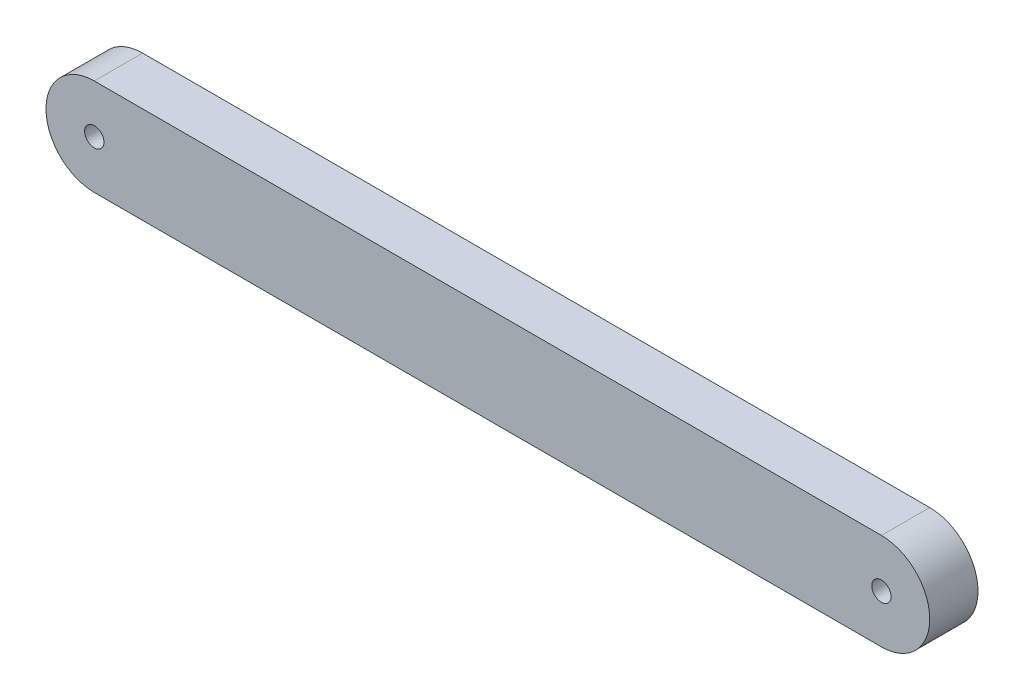
ISO-10303-21;
HEADER;
FILE_DESCRIPTION(('STEP AP214'),'2;1');
FILE_NAME('part.step','',(''),(''),'','','');
FILE_SCHEMA(('AUTOMOTIVE_DESIGN { 1 0 10303 214 1 1 1 1 }'));
ENDSEC;
DATA;
#1=APPLICATION_CONTEXT('core data for automotive mechanical design processes');
#2=APPLICATION_PROTOCOL_DEFINITION('international standard','automotive_design',2000,#1);
#3=PRODUCT_CONTEXT('',#1,'mechanical');
#4=PRODUCT('Part','Part','',(#3));
#5=PRODUCT_RELATED_PRODUCT_CATEGORY('part','',(#4));
#6=PRODUCT_DEFINITION_FORMATION('','',#4);
#7=PRODUCT_DEFINITION_CONTEXT('part definition',#1,'design');
#8=PRODUCT_DEFINITION('design','',#6,#7);
#9=PRODUCT_DEFINITION_SHAPE('','',#8);
#10=(LENGTH_UNIT() NAMED_UNIT(*) SI_UNIT(.MILLI.,.METRE.));
#11=(NAMED_UNIT(*) PLANE_ANGLE_UNIT() SI_UNIT($,.RADIAN.));
#12=(NAMED_UNIT(*) SI_UNIT($,.STERADIAN.) SOLID_ANGLE_UNIT());
#13=UNCERTAINTY_MEASURE_WITH_UNIT(LENGTH_MEASURE(1.E-05),#10,'distance_accuracy_value','');
#14=(GEOMETRIC_REPRESENTATION_CONTEXT(3) GLOBAL_UNCERTAINTY_ASSIGNED_CONTEXT((#13)) GLOBAL_UNIT_ASSIGNED_CONTEXT((#10,
#11,#12)) REPRESENTATION_CONTEXT('',''));
#15=CARTESIAN_POINT('',(0.,0.,0.));
#16=DIRECTION('',(0.,0.,1.));
#17=DIRECTION('',(1.,0.,0.));
#18=AXIS2_PLACEMENT_3D('',#15,#16,#17);
#19=CARTESIAN_POINT('',(-30.2328308207705,7.50418760469011,10.));
#20=DIRECTION('',(0.,0.,1.));
#21=DIRECTION('',(1.,0.,0.));
#22=AXIS2_PLACEMENT_3D('',#19,#20,#21);
#23=PLANE('',#22);
#24=CARTESIAN_POINT('',(-193.23283082077,7.50418760469013,10.));
#25=DIRECTION('',(0.,0.,1.));
#26=DIRECTION('',(1.,0.,0.));
#27=AXIS2_PLACEMENT_3D('',#24,#25,#26);
#28=CIRCLE('',#27,2.);
#29=CARTESIAN_POINT('',(-191.23283082077,7.50418760469013,10.));
#30=VERTEX_POINT('',#29);
#31=EDGE_CURVE('E100',#30,#30,#28,.T.);
#32=ORIENTED_EDGE('',*,*,#31,.F.);
#33=EDGE_LOOP('',(#32));
#34=FACE_BOUND('',#33,.T.);
#35=CARTESIAN_POINT('',(-30.2328308207705,7.50418760469011,10.));
#36=DIRECTION('',(0.,0.,1.));
#37=DIRECTION('',(1.,0.,0.));
#38=AXIS2_PLACEMENT_3D('',#35,#36,#37);
#39=CIRCLE('',#38,10.);
#40=CARTESIAN_POINT('',(-30.2328308207705,-2.49581239530989,10.));
#41=VERTEX_POINT('',#40);
#42=CARTESIAN_POINT('',(-30.2328308207705,17.5041876046901,10.));
#43=VERTEX_POINT('',#42);
#44=EDGE_CURVE('E85',#41,#43,#39,.T.);
#45=ORIENTED_EDGE('',*,*,#44,.T.);
#46=DIRECTION('',(-1.,0.,0.));
#47=VECTOR('',#46,1.);
#48=CARTESIAN_POINT('',(-30.2328308207705,17.5041876046901,10.));
#49=LINE('',#48,#47);
#50=CARTESIAN_POINT('',(-193.23283082077,17.5041876046901,10.));
#51=VERTEX_POINT('',#50);
#52=EDGE_CURVE('E80',#43,#51,#49,.T.);
#53=ORIENTED_EDGE('',*,*,#52,.T.);
#54=CARTESIAN_POINT('',(-193.23283082077,7.50418760469013,10.));
#55=DIRECTION('',(0.,0.,1.));
#56=DIRECTION('',(1.,0.,0.));
#57=AXIS2_PLACEMENT_3D('',#54,#55,#56);
#58=CIRCLE('',#57,10.);
#59=CARTESIAN_POINT('',(-193.23283082077,-2.49581239530991,10.));
#60=VERTEX_POINT('',#59);
#61=EDGE_CURVE('E83',#51,#60,#58,.T.);
#62=ORIENTED_EDGE('',*,*,#61,.T.);
#63=DIRECTION('',(1.,0.,0.));
#64=VECTOR('',#63,1.);
#65=CARTESIAN_POINT('',(-30.2328308207705,-2.49581239530989,10.));
#66=LINE('',#65,#64);
#67=EDGE_CURVE('E50',#60,#41,#66,.T.);
#68=ORIENTED_EDGE('',*,*,#67,.T.);
#69=EDGE_LOOP('',(#45,#53,#62,#68));
#70=FACE_BOUND('',#69,.T.);
#71=CARTESIAN_POINT('',(-30.2328308207705,7.50418760469011,10.));
#72=DIRECTION('',(0.,0.,1.));
#73=DIRECTION('',(1.,0.,0.));
#74=AXIS2_PLACEMENT_3D('',#71,#72,#73);
#75=CIRCLE('',#74,2.);
#76=CARTESIAN_POINT('',(-28.2328308207705,7.50418760469011,10.));
#77=VERTEX_POINT('',#76);
#78=EDGE_CURVE('E115',#77,#77,#75,.T.);
#79=ORIENTED_EDGE('',*,*,#78,.F.);
#80=EDGE_LOOP('',(#79));
#81=FACE_BOUND('',#80,.T.);
#82=ADVANCED_FACE('F33',(#34,#70,#81),#23,.T.);
#83=CARTESIAN_POINT('',(-30.2328308207705,7.50418760469011,0.));
#84=DIRECTION('',(0.,0.,1.));
#85=DIRECTION('',(1.,0.,0.));
#86=AXIS2_PLACEMENT_3D('',#83,#84,#85);
#87=PLANE('',#86);
#88=CARTESIAN_POINT('',(-30.2328308207705,7.50418760469011,0.));
#89=DIRECTION('',(0.,0.,1.));
#90=DIRECTION('',(1.,0.,0.));
#91=AXIS2_PLACEMENT_3D('',#88,#89,#90);
#92=CIRCLE('',#91,10.);
#93=CARTESIAN_POINT('',(-30.2328308207705,-2.49581239530989,0.));
#94=VERTEX_POINT('',#93);
#95=CARTESIAN_POINT('',(-30.2328308207705,17.5041876046901,0.));
#96=VERTEX_POINT('',#95);
#97=EDGE_CURVE('E97',#94,#96,#92,.T.);
#98=ORIENTED_EDGE('',*,*,#97,.F.);
#99=DIRECTION('',(1.,0.,0.));
#100=VECTOR('',#99,1.);
#101=CARTESIAN_POINT('',(-30.2328308207705,-2.49581239530989,0.));
#102=LINE('',#101,#100);
#103=CARTESIAN_POINT('',(-193.23283082077,-2.49581239530991,0.));
#104=VERTEX_POINT('',#103);
#105=EDGE_CURVE('E73',#104,#94,#102,.T.);
#106=ORIENTED_EDGE('',*,*,#105,.F.);
#107=CARTESIAN_POINT('',(-193.23283082077,7.50418760469013,0.));
#108=DIRECTION('',(0.,0.,1.));
#109=DIRECTION('',(1.,0.,0.));
#110=AXIS2_PLACEMENT_3D('',#107,#108,#109);
#111=CIRCLE('',#110,10.);
#112=CARTESIAN_POINT('',(-193.23283082077,17.5041876046901,0.));
#113=VERTEX_POINT('',#112);
#114=EDGE_CURVE('E67',#113,#104,#111,.T.);
#115=ORIENTED_EDGE('',*,*,#114,.F.);
#116=DIRECTION('',(-1.,0.,0.));
#117=VECTOR('',#116,1.);
#118=CARTESIAN_POINT('',(-30.2328308207705,17.5041876046901,0.));
#119=LINE('',#118,#117);
#120=EDGE_CURVE('E89',#96,#113,#119,.T.);
#121=ORIENTED_EDGE('',*,*,#120,.F.);
#122=EDGE_LOOP('',(#98,#106,#115,#121));
#123=FACE_BOUND('',#122,.T.);
#124=CARTESIAN_POINT('',(-193.23283082077,7.50418760469013,0.));
#125=DIRECTION('',(0.,0.,1.));
#126=DIRECTION('',(1.,0.,0.));
#127=AXIS2_PLACEMENT_3D('',#124,#125,#126);
#128=CIRCLE('',#127,2.);
#129=CARTESIAN_POINT('',(-191.23283082077,7.50418760469013,0.));
#130=VERTEX_POINT('',#129);
#131=EDGE_CURVE('E112',#130,#130,#128,.T.);
#132=ORIENTED_EDGE('',*,*,#131,.T.);
#133=EDGE_LOOP('',(#132));
#134=FACE_BOUND('',#133,.T.);
#135=CARTESIAN_POINT('',(-30.2328308207705,7.50418760469011,0.));
#136=DIRECTION('',(0.,0.,1.));
#137=DIRECTION('',(1.,0.,0.));
#138=AXIS2_PLACEMENT_3D('',#135,#136,#137);
#139=CIRCLE('',#138,2.);
#140=CARTESIAN_POINT('',(-28.2328308207705,7.50418760469011,0.));
#141=VERTEX_POINT('',#140);
#142=EDGE_CURVE('E118',#141,#141,#139,.T.);
#143=ORIENTED_EDGE('',*,*,#142,.T.);
#144=EDGE_LOOP('',(#143));
#145=FACE_BOUND('',#144,.T.);
#146=ADVANCED_FACE('F108',(#123,#134,#145),#87,.F.);
#147=CARTESIAN_POINT('',(-30.2328308207705,7.50418760469011,10.));
#148=DIRECTION('',(0.,0.,-1.));
#149=DIRECTION('',(-1.,0.,0.));
#150=AXIS2_PLACEMENT_3D('',#147,#148,#149);
#151=CYLINDRICAL_SURFACE('',#150,10.);
#152=ORIENTED_EDGE('',*,*,#97,.T.);
#153=DIRECTION('',(0.,0.,-1.));
#154=VECTOR('',#153,1.);
#155=CARTESIAN_POINT('',(-30.2328308207705,17.5041876046901,10.));
#156=LINE('',#155,#154);
#157=EDGE_CURVE('E11',#43,#96,#156,.T.);
#158=ORIENTED_EDGE('',*,*,#157,.F.);
#159=ORIENTED_EDGE('',*,*,#44,.F.);
#160=DIRECTION('',(0.,0.,-1.));
#161=VECTOR('',#160,1.);
#162=CARTESIAN_POINT('',(-30.2328308207705,-2.49581239530989,10.));
#163=LINE('',#162,#161);
#164=EDGE_CURVE('E93',#41,#94,#163,.T.);
#165=ORIENTED_EDGE('',*,*,#164,.T.);
#166=EDGE_LOOP('',(#152,#158,#159,#165));
#167=FACE_BOUND('',#166,.T.);
#168=ADVANCED_FACE('F35',(#167),#151,.T.);
#169=CARTESIAN_POINT('',(-30.2328308207705,17.5041876046901,10.));
#170=DIRECTION('',(0.,-1.,0.));
#171=DIRECTION('',(1.,0.,0.));
#172=AXIS2_PLACEMENT_3D('',#169,#170,#171);
#173=PLANE('',#172);
#174=ORIENTED_EDGE('',*,*,#120,.T.);
#175=DIRECTION('',(0.,0.,-1.));
#176=VECTOR('',#175,1.);
#177=CARTESIAN_POINT('',(-193.23283082077,17.5041876046901,10.));
#178=LINE('',#177,#176);
#179=EDGE_CURVE('E42',#51,#113,#178,.T.);
#180=ORIENTED_EDGE('',*,*,#179,.F.);
#181=ORIENTED_EDGE('',*,*,#52,.F.);
#182=ORIENTED_EDGE('',*,*,#157,.T.);
#183=EDGE_LOOP('',(#174,#180,#181,#182));
#184=FACE_BOUND('',#183,.T.);
#185=ADVANCED_FACE('F88',(#184),#173,.F.);
#186=CARTESIAN_POINT('',(-193.23283082077,7.50418760469013,10.));
#187=DIRECTION('',(0.,0.,-1.));
#188=DIRECTION('',(-1.,0.,0.));
#189=AXIS2_PLACEMENT_3D('',#186,#187,#188);
#190=CYLINDRICAL_SURFACE('',#189,10.);
#191=ORIENTED_EDGE('',*,*,#114,.T.);
#192=DIRECTION('',(0.,0.,-1.));
#193=VECTOR('',#192,1.);
#194=CARTESIAN_POINT('',(-193.23283082077,-2.49581239530991,10.));
#195=LINE('',#194,#193);
#196=EDGE_CURVE('E90',#60,#104,#195,.T.);
#197=ORIENTED_EDGE('',*,*,#196,.F.);
#198=ORIENTED_EDGE('',*,*,#61,.F.);
#199=ORIENTED_EDGE('',*,*,#179,.T.);
#200=EDGE_LOOP('',(#191,#197,#198,#199));
#201=FACE_BOUND('',#200,.T.);
#202=ADVANCED_FACE('F91',(#201),#190,.T.);
#203=CARTESIAN_POINT('',(-30.2328308207705,-2.49581239530989,10.));
#204=DIRECTION('',(0.,1.,0.));
#205=DIRECTION('',(-1.,0.,0.));
#206=AXIS2_PLACEMENT_3D('',#203,#204,#205);
#207=PLANE('',#206);
#208=ORIENTED_EDGE('',*,*,#105,.T.);
#209=ORIENTED_EDGE('',*,*,#164,.F.);
#210=ORIENTED_EDGE('',*,*,#67,.F.);
#211=ORIENTED_EDGE('',*,*,#196,.T.);
#212=EDGE_LOOP('',(#208,#209,#210,#211));
#213=FACE_BOUND('',#212,.T.);
#214=ADVANCED_FACE('F105',(#213),#207,.F.);
#215=CARTESIAN_POINT('',(-193.23283082077,7.50418760469013,10.));
#216=DIRECTION('',(0.,0.,-1.));
#217=DIRECTION('',(-1.,0.,0.));
#218=AXIS2_PLACEMENT_3D('',#215,#216,#217);
#219=CYLINDRICAL_SURFACE('',#218,2.);
#220=ORIENTED_EDGE('',*,*,#31,.T.);
#221=EDGE_LOOP('',(#220));
#222=FACE_BOUND('',#221,.T.);
#223=ORIENTED_EDGE('',*,*,#131,.F.);
#224=EDGE_LOOP('',(#223));
#225=FACE_BOUND('',#224,.T.);
#226=ADVANCED_FACE('F135',(#222,#225),#219,.F.);
#227=CARTESIAN_POINT('',(-30.2328308207705,7.50418760469011,10.));
#228=DIRECTION('',(0.,0.,-1.));
#229=DIRECTION('',(-1.,0.,0.));
#230=AXIS2_PLACEMENT_3D('',#227,#228,#229);
#231=CYLINDRICAL_SURFACE('',#230,2.);
#232=ORIENTED_EDGE('',*,*,#78,.T.);
#233=EDGE_LOOP('',(#232));
#234=FACE_BOUND('',#233,.T.);
#235=ORIENTED_EDGE('',*,*,#142,.F.);
#236=EDGE_LOOP('',(#235));
#237=FACE_BOUND('',#236,.T.);
#238=ADVANCED_FACE('F124',(#234,#237),#231,.F.);
#239=CLOSED_SHELL('',(#82,#146,#168,#185,#202,#214,#226,#238));
#240=MANIFOLD_SOLID_BREP('B2',#239);
#241=ADVANCED_BREP_SHAPE_REPRESENTATION('',(#18,#240),#14);
#242=SHAPE_DEFINITION_REPRESENTATION(#9,#241);
ENDSEC;
END-ISO-10303-21;
